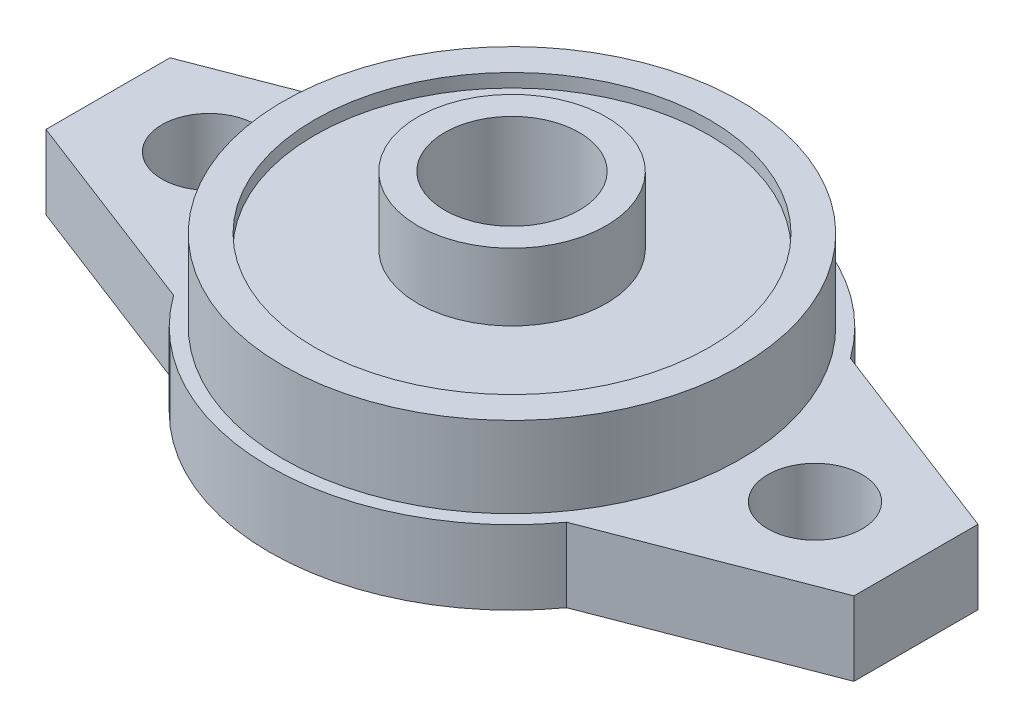
ISO-10303-21;
HEADER;
FILE_DESCRIPTION(('STEP AP214'),'2;1');
FILE_NAME('part.step','',(''),(''),'','','');
FILE_SCHEMA(('AUTOMOTIVE_DESIGN { 1 0 10303 214 1 1 1 1 }'));
ENDSEC;
DATA;
#1=APPLICATION_CONTEXT('core data for automotive mechanical design processes');
#2=APPLICATION_PROTOCOL_DEFINITION('international standard','automotive_design',2000,#1);
#3=PRODUCT_CONTEXT('',#1,'mechanical');
#4=PRODUCT('Part','Part','',(#3));
#5=PRODUCT_RELATED_PRODUCT_CATEGORY('part','',(#4));
#6=PRODUCT_DEFINITION_FORMATION('','',#4);
#7=PRODUCT_DEFINITION_CONTEXT('part definition',#1,'design');
#8=PRODUCT_DEFINITION('design','',#6,#7);
#9=PRODUCT_DEFINITION_SHAPE('','',#8);
#10=(LENGTH_UNIT() NAMED_UNIT(*) SI_UNIT(.MILLI.,.METRE.));
#11=(NAMED_UNIT(*) PLANE_ANGLE_UNIT() SI_UNIT($,.RADIAN.));
#12=(NAMED_UNIT(*) SI_UNIT($,.STERADIAN.) SOLID_ANGLE_UNIT());
#13=UNCERTAINTY_MEASURE_WITH_UNIT(LENGTH_MEASURE(1.E-05),#10,'distance_accuracy_value','');
#14=(GEOMETRIC_REPRESENTATION_CONTEXT(3) GLOBAL_UNCERTAINTY_ASSIGNED_CONTEXT((#13)) GLOBAL_UNIT_ASSIGNED_CONTEXT((#10,
#11,#12)) REPRESENTATION_CONTEXT('',''));
#15=CARTESIAN_POINT('',(0.,0.,0.));
#16=DIRECTION('',(0.,0.,1.));
#17=DIRECTION('',(1.,0.,0.));
#18=AXIS2_PLACEMENT_3D('',#15,#16,#17);
#19=CARTESIAN_POINT('',(0.,11.5,0.));
#20=DIRECTION('',(0.,1.,0.));
#21=DIRECTION('',(0.,0.,1.));
#22=AXIS2_PLACEMENT_3D('',#19,#20,#21);
#23=PLANE('',#22);
#24=CARTESIAN_POINT('',(0.,11.5,0.));
#25=DIRECTION('',(0.,1.,0.));
#26=DIRECTION('',(0.,0.,1.));
#27=AXIS2_PLACEMENT_3D('',#24,#25,#26);
#28=CIRCLE('',#27,14.65);
#29=CARTESIAN_POINT('',(0.,11.5,14.65));
#30=VERTEX_POINT('',#29);
#31=EDGE_CURVE('E208',#30,#30,#28,.T.);
#32=ORIENTED_EDGE('',*,*,#31,.F.);
#33=EDGE_LOOP('',(#32));
#34=FACE_BOUND('',#33,.T.);
#35=CARTESIAN_POINT('',(0.,11.5,0.));
#36=DIRECTION('',(0.,1.,0.));
#37=DIRECTION('',(0.,0.,1.));
#38=AXIS2_PLACEMENT_3D('',#35,#36,#37);
#39=CIRCLE('',#38,17.);
#40=CARTESIAN_POINT('',(0.,11.5,17.));
#41=VERTEX_POINT('',#40);
#42=EDGE_CURVE('E142',#41,#41,#39,.T.);
#43=ORIENTED_EDGE('',*,*,#42,.T.);
#44=EDGE_LOOP('',(#43));
#45=FACE_BOUND('',#44,.T.);
#46=ADVANCED_FACE('F36',(#34,#45),#23,.T.);
#47=CARTESIAN_POINT('',(0.,5.5,0.));
#48=DIRECTION('',(0.,1.,0.));
#49=DIRECTION('',(0.,0.,1.));
#50=AXIS2_PLACEMENT_3D('',#47,#48,#49);
#51=PLANE('',#50);
#52=CARTESIAN_POINT('',(22.5,5.5,0.));
#53=DIRECTION('',(0.,1.,0.));
#54=DIRECTION('',(0.,0.,1.));
#55=AXIS2_PLACEMENT_3D('',#52,#53,#54);
#56=CIRCLE('',#55,3.5);
#57=CARTESIAN_POINT('',(22.5,5.5,3.5));
#58=VERTEX_POINT('',#57);
#59=EDGE_CURVE('E130',#58,#58,#56,.F.);
#60=ORIENTED_EDGE('',*,*,#59,.T.);
#61=EDGE_LOOP('',(#60));
#62=FACE_BOUND('',#61,.T.);
#63=DIRECTION('',(0.933212921875814,0.,0.359323868458535));
#64=VECTOR('',#63,1.);
#65=CARTESIAN_POINT('',(-5.41756913485407,5.5,14.0701633417509));
#66=LINE('',#65,#64);
#67=CARTESIAN_POINT('',(-30.,5.5,4.60495561956913));
#68=VERTEX_POINT('',#67);
#69=CARTESIAN_POINT('',(-14.593498700004,5.5,10.5370676989845));
#70=VERTEX_POINT('',#69);
#71=EDGE_CURVE('E191',#68,#70,#66,.T.);
#72=ORIENTED_EDGE('',*,*,#71,.T.);
#73=CARTESIAN_POINT('',(0.,5.5,0.));
#74=DIRECTION('',(0.,1.,0.));
#75=DIRECTION('',(0.,0.,1.));
#76=AXIS2_PLACEMENT_3D('',#73,#74,#75);
#77=CIRCLE('',#76,18.);
#78=CARTESIAN_POINT('',(14.593498700004,5.5,10.5370676989845));
#79=VERTEX_POINT('',#78);
#80=EDGE_CURVE('E92',#70,#79,#77,.T.);
#81=ORIENTED_EDGE('',*,*,#80,.T.);
#82=DIRECTION('',(-0.933212921875814,0.,0.359323868458535));
#83=VECTOR('',#82,1.);
#84=CARTESIAN_POINT('',(5.41756913485407,5.5,14.0701633417509));
#85=LINE('',#84,#83);
#86=CARTESIAN_POINT('',(30.,5.5,4.60495561956913));
#87=VERTEX_POINT('',#86);
#88=EDGE_CURVE('E177',#87,#79,#85,.T.);
#89=ORIENTED_EDGE('',*,*,#88,.F.);
#90=DIRECTION('',(0.,0.,1.));
#91=VECTOR('',#90,1.);
#92=CARTESIAN_POINT('',(30.,5.5,0.));
#93=LINE('',#92,#91);
#94=CARTESIAN_POINT('',(30.,5.5,-4.60495561956913));
#95=VERTEX_POINT('',#94);
#96=EDGE_CURVE('E189',#95,#87,#93,.T.);
#97=ORIENTED_EDGE('',*,*,#96,.F.);
#98=DIRECTION('',(-0.933212921875814,0.,-0.359323868458536));
#99=VECTOR('',#98,1.);
#100=CARTESIAN_POINT('',(5.41756913485408,5.5,-14.0701633417509));
#101=LINE('',#100,#99);
#102=CARTESIAN_POINT('',(14.593498700004,5.5,-10.5370676989845));
#103=VERTEX_POINT('',#102);
#104=EDGE_CURVE('E113',#95,#103,#101,.T.);
#105=ORIENTED_EDGE('',*,*,#104,.T.);
#106=CARTESIAN_POINT('',(-14.593498700004,5.5,-10.5370676989845));
#107=VERTEX_POINT('',#106);
#108=EDGE_CURVE('E105',#103,#107,#77,.T.);
#109=ORIENTED_EDGE('',*,*,#108,.T.);
#110=DIRECTION('',(0.933212921875814,0.,-0.359323868458536));
#111=VECTOR('',#110,1.);
#112=CARTESIAN_POINT('',(-5.41756913485408,5.5,-14.0701633417509));
#113=LINE('',#112,#111);
#114=CARTESIAN_POINT('',(-30.,5.5,-4.60495561956913));
#115=VERTEX_POINT('',#114);
#116=EDGE_CURVE('E110',#115,#107,#113,.T.);
#117=ORIENTED_EDGE('',*,*,#116,.F.);
#118=DIRECTION('',(0.,0.,1.));
#119=VECTOR('',#118,1.);
#120=CARTESIAN_POINT('',(-30.,5.5,0.));
#121=LINE('',#120,#119);
#122=EDGE_CURVE('E53',#115,#68,#121,.T.);
#123=ORIENTED_EDGE('',*,*,#122,.T.);
#124=EDGE_LOOP('',(#72,#81,#89,#97,#105,#109,#117,#123));
#125=FACE_BOUND('',#124,.T.);
#126=CARTESIAN_POINT('',(-22.5,5.5,0.));
#127=DIRECTION('',(0.,1.,0.));
#128=DIRECTION('',(0.,0.,1.));
#129=AXIS2_PLACEMENT_3D('',#126,#127,#128);
#130=CIRCLE('',#129,3.5);
#131=CARTESIAN_POINT('',(-22.5,5.5,3.5));
#132=VERTEX_POINT('',#131);
#133=EDGE_CURVE('E165',#132,#132,#130,.T.);
#134=ORIENTED_EDGE('',*,*,#133,.F.);
#135=EDGE_LOOP('',(#134));
#136=FACE_BOUND('',#135,.T.);
#137=CARTESIAN_POINT('',(0.,5.5,0.));
#138=DIRECTION('',(0.,1.,0.));
#139=DIRECTION('',(0.,0.,1.));
#140=AXIS2_PLACEMENT_3D('',#137,#138,#139);
#141=CIRCLE('',#140,17.);
#142=CARTESIAN_POINT('',(0.,5.5,17.));
#143=VERTEX_POINT('',#142);
#144=EDGE_CURVE('E196',#143,#143,#141,.T.);
#145=ORIENTED_EDGE('',*,*,#144,.F.);
#146=EDGE_LOOP('',(#145));
#147=FACE_BOUND('',#146,.T.);
#148=ADVANCED_FACE('F107',(#62,#125,#136,#147),#51,.T.);
#149=CARTESIAN_POINT('',(-5.41756913485407,5.5,14.0701633417509));
#150=DIRECTION('',(0.359323868458535,0.,-0.933212921875814));
#151=DIRECTION('',(-0.933212921875814,0.,-0.359323868458535));
#152=AXIS2_PLACEMENT_3D('',#149,#150,#151);
#153=PLANE('',#152);
#154=DIRECTION('',(0.933212921875814,0.,0.359323868458535));
#155=VECTOR('',#154,1.);
#156=CARTESIAN_POINT('',(-5.41756913485407,0.,14.0701633417509));
#157=LINE('',#156,#155);
#158=CARTESIAN_POINT('',(-30.,0.,4.60495561956913));
#159=VERTEX_POINT('',#158);
#160=CARTESIAN_POINT('',(-14.593498700004,0.,10.5370676989845));
#161=VERTEX_POINT('',#160);
#162=EDGE_CURVE('E141',#159,#161,#157,.T.);
#163=ORIENTED_EDGE('',*,*,#162,.T.);
#164=DIRECTION('',(0.,-1.,0.));
#165=VECTOR('',#164,1.);
#166=CARTESIAN_POINT('',(-14.593498700004,5.5,10.5370676989845));
#167=LINE('',#166,#165);
#168=EDGE_CURVE('E11',#70,#161,#167,.T.);
#169=ORIENTED_EDGE('',*,*,#168,.F.);
#170=ORIENTED_EDGE('',*,*,#71,.F.);
#171=DIRECTION('',(0.,-1.,0.));
#172=VECTOR('',#171,1.);
#173=CARTESIAN_POINT('',(-30.,5.5,4.60495561956913));
#174=LINE('',#173,#172);
#175=EDGE_CURVE('E137',#68,#159,#174,.T.);
#176=ORIENTED_EDGE('',*,*,#175,.T.);
#177=EDGE_LOOP('',(#163,#169,#170,#176));
#178=FACE_BOUND('',#177,.T.);
#179=ADVANCED_FACE('F244',(#178),#153,.F.);
#180=CARTESIAN_POINT('',(0.,5.5,0.));
#181=DIRECTION('',(0.,-1.,0.));
#182=DIRECTION('',(0.,0.,-1.));
#183=AXIS2_PLACEMENT_3D('',#180,#181,#182);
#184=CYLINDRICAL_SURFACE('',#183,18.);
#185=CARTESIAN_POINT('',(0.,0.,0.));
#186=DIRECTION('',(0.,1.,0.));
#187=DIRECTION('',(0.,0.,1.));
#188=AXIS2_PLACEMENT_3D('',#185,#186,#187);
#189=CIRCLE('',#188,18.);
#190=CARTESIAN_POINT('',(14.593498700004,0.,10.5370676989845));
#191=VERTEX_POINT('',#190);
#192=EDGE_CURVE('E145',#161,#191,#189,.T.);
#193=ORIENTED_EDGE('',*,*,#192,.T.);
#194=DIRECTION('',(0.,-1.,0.));
#195=VECTOR('',#194,1.);
#196=CARTESIAN_POINT('',(14.593498700004,5.5,10.5370676989845));
#197=LINE('',#196,#195);
#198=EDGE_CURVE('E45',#79,#191,#197,.T.);
#199=ORIENTED_EDGE('',*,*,#198,.F.);
#200=ORIENTED_EDGE('',*,*,#80,.F.);
#201=ORIENTED_EDGE('',*,*,#168,.T.);
#202=EDGE_LOOP('',(#193,#199,#200,#201));
#203=FACE_BOUND('',#202,.T.);
#204=ADVANCED_FACE('F178',(#203),#184,.T.);
#205=CARTESIAN_POINT('',(5.41756913485407,5.5,14.0701633417509));
#206=DIRECTION('',(0.359323868458535,0.,0.933212921875814));
#207=DIRECTION('',(0.933212921875814,0.,-0.359323868458535));
#208=AXIS2_PLACEMENT_3D('',#205,#206,#207);
#209=PLANE('',#208);
#210=DIRECTION('',(-0.933212921875814,0.,0.359323868458535));
#211=VECTOR('',#210,1.);
#212=CARTESIAN_POINT('',(5.41756913485407,0.,14.0701633417509));
#213=LINE('',#212,#211);
#214=CARTESIAN_POINT('',(30.,0.,4.60495561956913));
#215=VERTEX_POINT('',#214);
#216=EDGE_CURVE('E148',#215,#191,#213,.T.);
#217=ORIENTED_EDGE('',*,*,#216,.F.);
#218=DIRECTION('',(0.,-1.,0.));
#219=VECTOR('',#218,1.);
#220=CARTESIAN_POINT('',(30.,5.5,4.60495561956913));
#221=LINE('',#220,#219);
#222=EDGE_CURVE('E171',#87,#215,#221,.T.);
#223=ORIENTED_EDGE('',*,*,#222,.F.);
#224=ORIENTED_EDGE('',*,*,#88,.T.);
#225=ORIENTED_EDGE('',*,*,#198,.T.);
#226=EDGE_LOOP('',(#217,#223,#224,#225));
#227=FACE_BOUND('',#226,.T.);
#228=ADVANCED_FACE('F175',(#227),#209,.T.);
#229=CARTESIAN_POINT('',(30.,5.5,0.));
#230=DIRECTION('',(1.,0.,0.));
#231=DIRECTION('',(0.,0.,-1.));
#232=AXIS2_PLACEMENT_3D('',#229,#230,#231);
#233=PLANE('',#232);
#234=DIRECTION('',(0.,0.,1.));
#235=VECTOR('',#234,1.);
#236=CARTESIAN_POINT('',(30.,0.,0.));
#237=LINE('',#236,#235);
#238=CARTESIAN_POINT('',(30.,0.,-4.60495561956913));
#239=VERTEX_POINT('',#238);
#240=EDGE_CURVE('E151',#239,#215,#237,.T.);
#241=ORIENTED_EDGE('',*,*,#240,.F.);
#242=DIRECTION('',(0.,-1.,0.));
#243=VECTOR('',#242,1.);
#244=CARTESIAN_POINT('',(30.,5.5,-4.60495561956913));
#245=LINE('',#244,#243);
#246=EDGE_CURVE('E169',#95,#239,#245,.T.);
#247=ORIENTED_EDGE('',*,*,#246,.F.);
#248=ORIENTED_EDGE('',*,*,#96,.T.);
#249=ORIENTED_EDGE('',*,*,#222,.T.);
#250=EDGE_LOOP('',(#241,#247,#248,#249));
#251=FACE_BOUND('',#250,.T.);
#252=ADVANCED_FACE('F187',(#251),#233,.T.);
#253=CARTESIAN_POINT('',(5.41756913485408,5.5,-14.0701633417509));
#254=DIRECTION('',(-0.359323868458536,0.,0.933212921875814));
#255=DIRECTION('',(0.933212921875814,0.,0.359323868458536));
#256=AXIS2_PLACEMENT_3D('',#253,#254,#255);
#257=PLANE('',#256);
#258=DIRECTION('',(-0.933212921875814,0.,-0.359323868458536));
#259=VECTOR('',#258,1.);
#260=CARTESIAN_POINT('',(5.41756913485408,0.,-14.0701633417509));
#261=LINE('',#260,#259);
#262=CARTESIAN_POINT('',(14.593498700004,0.,-10.5370676989845));
#263=VERTEX_POINT('',#262);
#264=EDGE_CURVE('E154',#239,#263,#261,.T.);
#265=ORIENTED_EDGE('',*,*,#264,.T.);
#266=DIRECTION('',(0.,-1.,0.));
#267=VECTOR('',#266,1.);
#268=CARTESIAN_POINT('',(14.593498700004,5.5,-10.5370676989845));
#269=LINE('',#268,#267);
#270=EDGE_CURVE('E126',#103,#263,#269,.T.);
#271=ORIENTED_EDGE('',*,*,#270,.F.);
#272=ORIENTED_EDGE('',*,*,#104,.F.);
#273=ORIENTED_EDGE('',*,*,#246,.T.);
#274=EDGE_LOOP('',(#265,#271,#272,#273));
#275=FACE_BOUND('',#274,.T.);
#276=ADVANCED_FACE('F270',(#275),#257,.F.);
#277=CARTESIAN_POINT('',(-14.593498700004,0.,-10.5370676989845));
#278=VERTEX_POINT('',#277);
#279=EDGE_CURVE('E122',#263,#278,#189,.T.);
#280=ORIENTED_EDGE('',*,*,#279,.T.);
#281=DIRECTION('',(0.,-1.,0.));
#282=VECTOR('',#281,1.);
#283=CARTESIAN_POINT('',(-14.593498700004,5.5,-10.5370676989845));
#284=LINE('',#283,#282);
#285=EDGE_CURVE('E119',#107,#278,#284,.T.);
#286=ORIENTED_EDGE('',*,*,#285,.F.);
#287=ORIENTED_EDGE('',*,*,#108,.F.);
#288=ORIENTED_EDGE('',*,*,#270,.T.);
#289=EDGE_LOOP('',(#280,#286,#287,#288));
#290=FACE_BOUND('',#289,.T.);
#291=ADVANCED_FACE('F120',(#290),#184,.T.);
#292=CARTESIAN_POINT('',(-5.41756913485408,5.5,-14.0701633417509));
#293=DIRECTION('',(-0.359323868458536,0.,-0.933212921875814));
#294=DIRECTION('',(-0.933212921875814,0.,0.359323868458536));
#295=AXIS2_PLACEMENT_3D('',#292,#293,#294);
#296=PLANE('',#295);
#297=DIRECTION('',(0.933212921875814,0.,-0.359323868458536));
#298=VECTOR('',#297,1.);
#299=CARTESIAN_POINT('',(-5.41756913485408,0.,-14.0701633417509));
#300=LINE('',#299,#298);
#301=CARTESIAN_POINT('',(-30.,0.,-4.60495561956913));
#302=VERTEX_POINT('',#301);
#303=EDGE_CURVE('E156',#302,#278,#300,.T.);
#304=ORIENTED_EDGE('',*,*,#303,.F.);
#305=DIRECTION('',(0.,-1.,0.));
#306=VECTOR('',#305,1.);
#307=CARTESIAN_POINT('',(-30.,5.5,-4.60495561956913));
#308=LINE('',#307,#306);
#309=EDGE_CURVE('E81',#115,#302,#308,.T.);
#310=ORIENTED_EDGE('',*,*,#309,.F.);
#311=ORIENTED_EDGE('',*,*,#116,.T.);
#312=ORIENTED_EDGE('',*,*,#285,.T.);
#313=EDGE_LOOP('',(#304,#310,#311,#312));
#314=FACE_BOUND('',#313,.T.);
#315=ADVANCED_FACE('F128',(#314),#296,.T.);
#316=CARTESIAN_POINT('',(0.,5.5,0.));
#317=DIRECTION('',(0.,-1.,0.));
#318=DIRECTION('',(0.,0.,-1.));
#319=AXIS2_PLACEMENT_3D('',#316,#317,#318);
#320=CYLINDRICAL_SURFACE('',#319,5.);
#321=CARTESIAN_POINT('',(0.,0.,0.));
#322=DIRECTION('',(0.,1.,0.));
#323=DIRECTION('',(0.,0.,1.));
#324=AXIS2_PLACEMENT_3D('',#321,#322,#323);
#325=CIRCLE('',#324,5.);
#326=CARTESIAN_POINT('',(0.,0.,5.));
#327=VERTEX_POINT('',#326);
#328=EDGE_CURVE('E159',#327,#327,#325,.T.);
#329=ORIENTED_EDGE('',*,*,#328,.F.);
#330=EDGE_LOOP('',(#329));
#331=FACE_BOUND('',#330,.T.);
#332=CARTESIAN_POINT('',(0.,15.5,0.));
#333=DIRECTION('',(0.,1.,0.));
#334=DIRECTION('',(0.,0.,1.));
#335=AXIS2_PLACEMENT_3D('',#332,#333,#334);
#336=CIRCLE('',#335,5.);
#337=CARTESIAN_POINT('',(0.,15.5,5.));
#338=VERTEX_POINT('',#337);
#339=EDGE_CURVE('E204',#338,#338,#336,.T.);
#340=ORIENTED_EDGE('',*,*,#339,.T.);
#341=EDGE_LOOP('',(#340));
#342=FACE_BOUND('',#341,.T.);
#343=ADVANCED_FACE('F259',(#331,#342),#320,.F.);
#344=CARTESIAN_POINT('',(-30.,5.5,0.));
#345=DIRECTION('',(1.,0.,0.));
#346=DIRECTION('',(0.,0.,-1.));
#347=AXIS2_PLACEMENT_3D('',#344,#345,#346);
#348=PLANE('',#347);
#349=DIRECTION('',(0.,0.,1.));
#350=VECTOR('',#349,1.);
#351=CARTESIAN_POINT('',(-30.,0.,0.));
#352=LINE('',#351,#350);
#353=EDGE_CURVE('E84',#302,#159,#352,.T.);
#354=ORIENTED_EDGE('',*,*,#353,.T.);
#355=ORIENTED_EDGE('',*,*,#175,.F.);
#356=ORIENTED_EDGE('',*,*,#122,.F.);
#357=ORIENTED_EDGE('',*,*,#309,.T.);
#358=EDGE_LOOP('',(#354,#355,#356,#357));
#359=FACE_BOUND('',#358,.T.);
#360=ADVANCED_FACE('F262',(#359),#348,.F.);
#361=CARTESIAN_POINT('',(-22.5,5.5,0.));
#362=DIRECTION('',(0.,-1.,0.));
#363=DIRECTION('',(0.,0.,-1.));
#364=AXIS2_PLACEMENT_3D('',#361,#362,#363);
#365=CYLINDRICAL_SURFACE('',#364,3.5);
#366=ORIENTED_EDGE('',*,*,#133,.T.);
#367=EDGE_LOOP('',(#366));
#368=FACE_BOUND('',#367,.T.);
#369=CARTESIAN_POINT('',(-22.5,0.,0.));
#370=DIRECTION('',(0.,1.,0.));
#371=DIRECTION('',(0.,0.,1.));
#372=AXIS2_PLACEMENT_3D('',#369,#370,#371);
#373=CIRCLE('',#372,3.5);
#374=CARTESIAN_POINT('',(-22.5,0.,3.5));
#375=VERTEX_POINT('',#374);
#376=EDGE_CURVE('E138',#375,#375,#373,.T.);
#377=ORIENTED_EDGE('',*,*,#376,.F.);
#378=EDGE_LOOP('',(#377));
#379=FACE_BOUND('',#378,.T.);
#380=ADVANCED_FACE('F38',(#368,#379),#365,.F.);
#381=CARTESIAN_POINT('',(22.5,5.5,0.));
#382=DIRECTION('',(0.,-1.,0.));
#383=DIRECTION('',(0.,0.,-1.));
#384=AXIS2_PLACEMENT_3D('',#381,#382,#383);
#385=CYLINDRICAL_SURFACE('',#384,3.5);
#386=ORIENTED_EDGE('',*,*,#59,.F.);
#387=EDGE_LOOP('',(#386));
#388=FACE_BOUND('',#387,.T.);
#389=CARTESIAN_POINT('',(22.5,0.,0.));
#390=DIRECTION('',(0.,1.,0.));
#391=DIRECTION('',(0.,0.,1.));
#392=AXIS2_PLACEMENT_3D('',#389,#390,#391);
#393=CIRCLE('',#392,3.5);
#394=CARTESIAN_POINT('',(22.5,0.,3.5));
#395=VERTEX_POINT('',#394);
#396=EDGE_CURVE('E162',#395,#395,#393,.F.);
#397=ORIENTED_EDGE('',*,*,#396,.T.);
#398=EDGE_LOOP('',(#397));
#399=FACE_BOUND('',#398,.T.);
#400=ADVANCED_FACE('F254',(#388,#399),#385,.F.);
#401=CARTESIAN_POINT('',(0.,0.,0.));
#402=DIRECTION('',(0.,1.,0.));
#403=DIRECTION('',(0.,0.,1.));
#404=AXIS2_PLACEMENT_3D('',#401,#402,#403);
#405=PLANE('',#404);
#406=ORIENTED_EDGE('',*,*,#376,.T.);
#407=EDGE_LOOP('',(#406));
#408=FACE_BOUND('',#407,.T.);
#409=ORIENTED_EDGE('',*,*,#162,.F.);
#410=ORIENTED_EDGE('',*,*,#353,.F.);
#411=ORIENTED_EDGE('',*,*,#303,.T.);
#412=ORIENTED_EDGE('',*,*,#279,.F.);
#413=ORIENTED_EDGE('',*,*,#264,.F.);
#414=ORIENTED_EDGE('',*,*,#240,.T.);
#415=ORIENTED_EDGE('',*,*,#216,.T.);
#416=ORIENTED_EDGE('',*,*,#192,.F.);
#417=EDGE_LOOP('',(#409,#410,#411,#412,#413,#414,#415,#416));
#418=FACE_BOUND('',#417,.T.);
#419=ORIENTED_EDGE('',*,*,#328,.T.);
#420=EDGE_LOOP('',(#419));
#421=FACE_BOUND('',#420,.T.);
#422=ORIENTED_EDGE('',*,*,#396,.F.);
#423=EDGE_LOOP('',(#422));
#424=FACE_BOUND('',#423,.T.);
#425=ADVANCED_FACE('F182',(#408,#418,#421,#424),#405,.F.);
#426=CARTESIAN_POINT('',(0.,11.5,0.));
#427=DIRECTION('',(0.,-1.,0.));
#428=DIRECTION('',(0.,0.,-1.));
#429=AXIS2_PLACEMENT_3D('',#426,#427,#428);
#430=CYLINDRICAL_SURFACE('',#429,17.);
#431=ORIENTED_EDGE('',*,*,#42,.F.);
#432=EDGE_LOOP('',(#431));
#433=FACE_BOUND('',#432,.T.);
#434=ORIENTED_EDGE('',*,*,#144,.T.);
#435=EDGE_LOOP('',(#434));
#436=FACE_BOUND('',#435,.T.);
#437=ADVANCED_FACE('F236',(#433,#436),#430,.T.);
#438=CARTESIAN_POINT('',(0.,15.5,0.));
#439=DIRECTION('',(0.,1.,0.));
#440=DIRECTION('',(0.,0.,1.));
#441=AXIS2_PLACEMENT_3D('',#438,#439,#440);
#442=PLANE('',#441);
#443=CARTESIAN_POINT('',(0.,15.5,0.));
#444=DIRECTION('',(0.,1.,0.));
#445=DIRECTION('',(0.,0.,1.));
#446=AXIS2_PLACEMENT_3D('',#443,#444,#445);
#447=CIRCLE('',#446,7.);
#448=CARTESIAN_POINT('',(0.,15.5,7.));
#449=VERTEX_POINT('',#448);
#450=EDGE_CURVE('E199',#449,#449,#447,.T.);
#451=ORIENTED_EDGE('',*,*,#450,.T.);
#452=EDGE_LOOP('',(#451));
#453=FACE_BOUND('',#452,.T.);
#454=ORIENTED_EDGE('',*,*,#339,.F.);
#455=EDGE_LOOP('',(#454));
#456=FACE_BOUND('',#455,.T.);
#457=ADVANCED_FACE('F239',(#453,#456),#442,.T.);
#458=CARTESIAN_POINT('',(0.,15.5,0.));
#459=DIRECTION('',(0.,-1.,0.));
#460=DIRECTION('',(0.,0.,-1.));
#461=AXIS2_PLACEMENT_3D('',#458,#459,#460);
#462=CYLINDRICAL_SURFACE('',#461,7.);
#463=ORIENTED_EDGE('',*,*,#450,.F.);
#464=EDGE_LOOP('',(#463));
#465=FACE_BOUND('',#464,.T.);
#466=CARTESIAN_POINT('',(0.,10.5,0.));
#467=DIRECTION('',(0.,1.,0.));
#468=DIRECTION('',(0.,0.,1.));
#469=AXIS2_PLACEMENT_3D('',#466,#467,#468);
#470=CIRCLE('',#469,7.);
#471=CARTESIAN_POINT('',(0.,10.5,7.));
#472=VERTEX_POINT('',#471);
#473=EDGE_CURVE('E211',#472,#472,#470,.T.);
#474=ORIENTED_EDGE('',*,*,#473,.T.);
#475=EDGE_LOOP('',(#474));
#476=FACE_BOUND('',#475,.T.);
#477=ADVANCED_FACE('F217',(#465,#476),#462,.T.);
#478=CARTESIAN_POINT('',(0.,10.5,0.));
#479=DIRECTION('',(0.,1.,0.));
#480=DIRECTION('',(0.,0.,1.));
#481=AXIS2_PLACEMENT_3D('',#478,#479,#480);
#482=CYLINDRICAL_SURFACE('',#481,14.65);
#483=CARTESIAN_POINT('',(0.,10.5,0.));
#484=DIRECTION('',(0.,1.,0.));
#485=DIRECTION('',(0.,0.,1.));
#486=AXIS2_PLACEMENT_3D('',#483,#484,#485);
#487=CIRCLE('',#486,14.65);
#488=CARTESIAN_POINT('',(0.,10.5,14.65));
#489=VERTEX_POINT('',#488);
#490=EDGE_CURVE('E207',#489,#489,#487,.T.);
#491=ORIENTED_EDGE('',*,*,#490,.F.);
#492=EDGE_LOOP('',(#491));
#493=FACE_BOUND('',#492,.T.);
#494=ORIENTED_EDGE('',*,*,#31,.T.);
#495=EDGE_LOOP('',(#494));
#496=FACE_BOUND('',#495,.T.);
#497=ADVANCED_FACE('F222',(#493,#496),#482,.F.);
#498=CARTESIAN_POINT('',(0.,10.5,0.));
#499=DIRECTION('',(0.,1.,0.));
#500=DIRECTION('',(0.,0.,1.));
#501=AXIS2_PLACEMENT_3D('',#498,#499,#500);
#502=PLANE('',#501);
#503=ORIENTED_EDGE('',*,*,#473,.F.);
#504=EDGE_LOOP('',(#503));
#505=FACE_BOUND('',#504,.T.);
#506=ORIENTED_EDGE('',*,*,#490,.T.);
#507=EDGE_LOOP('',(#506));
#508=FACE_BOUND('',#507,.T.);
#509=ADVANCED_FACE('F219',(#505,#508),#502,.T.);
#510=CLOSED_SHELL('',(#46,#148,#179,#204,#228,#252,#276,#291,#315,#343,#360,#380,#400,#425,#437,
#457,#477,#497,#509));
#511=MANIFOLD_SOLID_BREP('B2',#510);
#512=ADVANCED_BREP_SHAPE_REPRESENTATION('',(#18,#511),#14);
#513=SHAPE_DEFINITION_REPRESENTATION(#9,#512);
ENDSEC;
END-ISO-10303-21;
